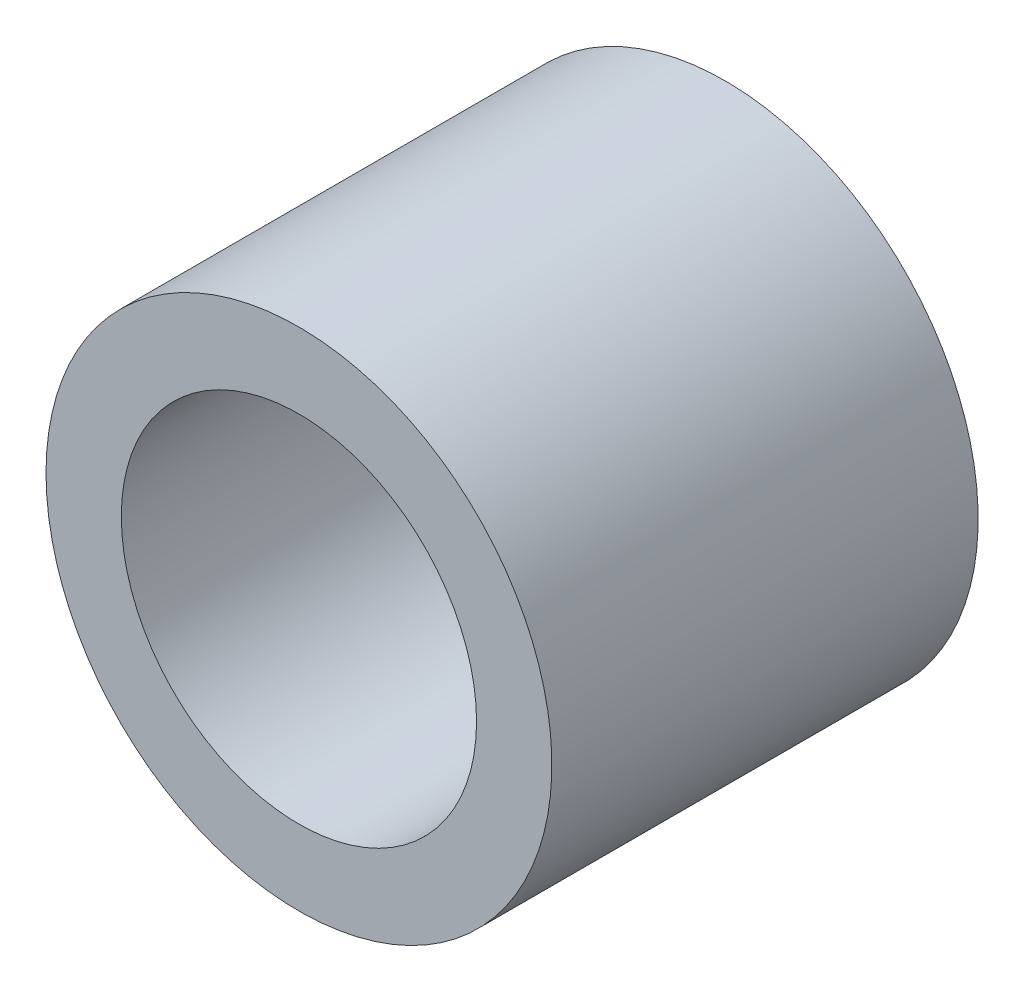
ISO-10303-21;
HEADER;
FILE_DESCRIPTION(('STEP AP214'),'2;1');
FILE_NAME('part.step','',(''),(''),'','','');
FILE_SCHEMA(('AUTOMOTIVE_DESIGN { 1 0 10303 214 1 1 1 1 }'));
ENDSEC;
DATA;
#1=APPLICATION_CONTEXT('core data for automotive mechanical design processes');
#2=APPLICATION_PROTOCOL_DEFINITION('international standard','automotive_design',2000,#1);
#3=PRODUCT_CONTEXT('',#1,'mechanical');
#4=PRODUCT('Part','Part','',(#3));
#5=PRODUCT_RELATED_PRODUCT_CATEGORY('part','',(#4));
#6=PRODUCT_DEFINITION_FORMATION('','',#4);
#7=PRODUCT_DEFINITION_CONTEXT('part definition',#1,'design');
#8=PRODUCT_DEFINITION('design','',#6,#7);
#9=PRODUCT_DEFINITION_SHAPE('','',#8);
#10=(LENGTH_UNIT() NAMED_UNIT(*) SI_UNIT(.MILLI.,.METRE.));
#11=(NAMED_UNIT(*) PLANE_ANGLE_UNIT() SI_UNIT($,.RADIAN.));
#12=(NAMED_UNIT(*) SI_UNIT($,.STERADIAN.) SOLID_ANGLE_UNIT());
#13=UNCERTAINTY_MEASURE_WITH_UNIT(LENGTH_MEASURE(1.E-05),#10,'distance_accuracy_value','');
#14=(GEOMETRIC_REPRESENTATION_CONTEXT(3) GLOBAL_UNCERTAINTY_ASSIGNED_CONTEXT((#13)) GLOBAL_UNIT_ASSIGNED_CONTEXT((#10,
#11,#12)) REPRESENTATION_CONTEXT('',''));
#15=CARTESIAN_POINT('',(0.,0.,0.));
#16=DIRECTION('',(0.,0.,1.));
#17=DIRECTION('',(1.,0.,0.));
#18=AXIS2_PLACEMENT_3D('',#15,#16,#17);
#19=CARTESIAN_POINT('',(-815.,500.,-679.5));
#20=DIRECTION('',(0.,0.,-1.));
#21=DIRECTION('',(1.,0.,0.));
#22=AXIS2_PLACEMENT_3D('',#19,#20,#21);
#23=CYLINDRICAL_SURFACE('',#22,2.5);
#24=CARTESIAN_POINT('',(-815.,500.,-679.5));
#25=DIRECTION('',(0.,0.,1.));
#26=DIRECTION('',(-1.,0.,0.));
#27=AXIS2_PLACEMENT_3D('',#24,#25,#26);
#28=CIRCLE('',#27,2.5);
#29=CARTESIAN_POINT('',(-817.5,500.,-679.5));
#30=VERTEX_POINT('',#29);
#31=EDGE_CURVE('E26',#30,#30,#28,.T.);
#32=ORIENTED_EDGE('',*,*,#31,.T.);
#33=EDGE_LOOP('',(#32));
#34=FACE_BOUND('',#33,.T.);
#35=CARTESIAN_POINT('',(-815.,500.,-684.5));
#36=DIRECTION('',(0.,0.,-1.));
#37=DIRECTION('',(1.,0.,0.));
#38=AXIS2_PLACEMENT_3D('',#35,#36,#37);
#39=CIRCLE('',#38,2.5);
#40=CARTESIAN_POINT('',(-812.5,500.,-684.5));
#41=VERTEX_POINT('',#40);
#42=EDGE_CURVE('E17',#41,#41,#39,.T.);
#43=ORIENTED_EDGE('',*,*,#42,.T.);
#44=EDGE_LOOP('',(#43));
#45=FACE_BOUND('',#44,.T.);
#46=ADVANCED_FACE('F13',(#34,#45),#23,.F.);
#47=CARTESIAN_POINT('',(-815.,500.,-679.5));
#48=DIRECTION('',(0.,0.,1.));
#49=DIRECTION('',(-1.,0.,0.));
#50=AXIS2_PLACEMENT_3D('',#47,#48,#49);
#51=PLANE('',#50);
#52=CARTESIAN_POINT('',(-815.,500.,-679.5));
#53=DIRECTION('',(0.,0.,1.));
#54=DIRECTION('',(-1.,0.,0.));
#55=AXIS2_PLACEMENT_3D('',#52,#53,#54);
#56=CIRCLE('',#55,3.56);
#57=CARTESIAN_POINT('',(-818.56,500.,-679.5));
#58=VERTEX_POINT('',#57);
#59=EDGE_CURVE('E9',#58,#58,#56,.T.);
#60=ORIENTED_EDGE('',*,*,#59,.T.);
#61=EDGE_LOOP('',(#60));
#62=FACE_BOUND('',#61,.T.);
#63=ORIENTED_EDGE('',*,*,#31,.F.);
#64=EDGE_LOOP('',(#63));
#65=FACE_BOUND('',#64,.T.);
#66=ADVANCED_FACE('F46',(#62,#65),#51,.T.);
#67=CARTESIAN_POINT('',(-815.,500.,-685.5));
#68=DIRECTION('',(0.,0.,1.));
#69=DIRECTION('',(-1.,0.,0.));
#70=AXIS2_PLACEMENT_3D('',#67,#68,#69);
#71=PLANE('',#70);
#72=CARTESIAN_POINT('',(-815.,500.,-685.5));
#73=DIRECTION('',(0.,0.,1.));
#74=DIRECTION('',(-1.,0.,0.));
#75=AXIS2_PLACEMENT_3D('',#72,#73,#74);
#76=CIRCLE('',#75,3.56);
#77=CARTESIAN_POINT('',(-818.56,500.,-685.5));
#78=VERTEX_POINT('',#77);
#79=EDGE_CURVE('E21',#78,#78,#76,.T.);
#80=ORIENTED_EDGE('',*,*,#79,.F.);
#81=EDGE_LOOP('',(#80));
#82=FACE_BOUND('',#81,.T.);
#83=ADVANCED_FACE('F42',(#82),#71,.F.);
#84=CARTESIAN_POINT('',(-815.,500.,-679.5));
#85=DIRECTION('',(0.,0.,-1.));
#86=DIRECTION('',(1.,0.,0.));
#87=AXIS2_PLACEMENT_3D('',#84,#85,#86);
#88=CYLINDRICAL_SURFACE('',#87,3.56);
#89=ORIENTED_EDGE('',*,*,#79,.T.);
#90=EDGE_LOOP('',(#89));
#91=FACE_BOUND('',#90,.T.);
#92=ORIENTED_EDGE('',*,*,#59,.F.);
#93=EDGE_LOOP('',(#92));
#94=FACE_BOUND('',#93,.T.);
#95=ADVANCED_FACE('F15',(#91,#94),#88,.T.);
#96=CARTESIAN_POINT('',(-815.,500.,-684.5));
#97=DIRECTION('',(0.,0.,-1.));
#98=DIRECTION('',(1.,0.,0.));
#99=AXIS2_PLACEMENT_3D('',#96,#97,#98);
#100=PLANE('',#99);
#101=ORIENTED_EDGE('',*,*,#42,.F.);
#102=EDGE_LOOP('',(#101));
#103=FACE_BOUND('',#102,.T.);
#104=ADVANCED_FACE('F35',(#103),#100,.F.);
#105=CLOSED_SHELL('',(#46,#66,#83,#95,#104));
#106=MANIFOLD_SOLID_BREP('B1',#105);
#107=ADVANCED_BREP_SHAPE_REPRESENTATION('',(#18,#106),#14);
#108=SHAPE_DEFINITION_REPRESENTATION(#9,#107);
ENDSEC;
END-ISO-10303-21;
